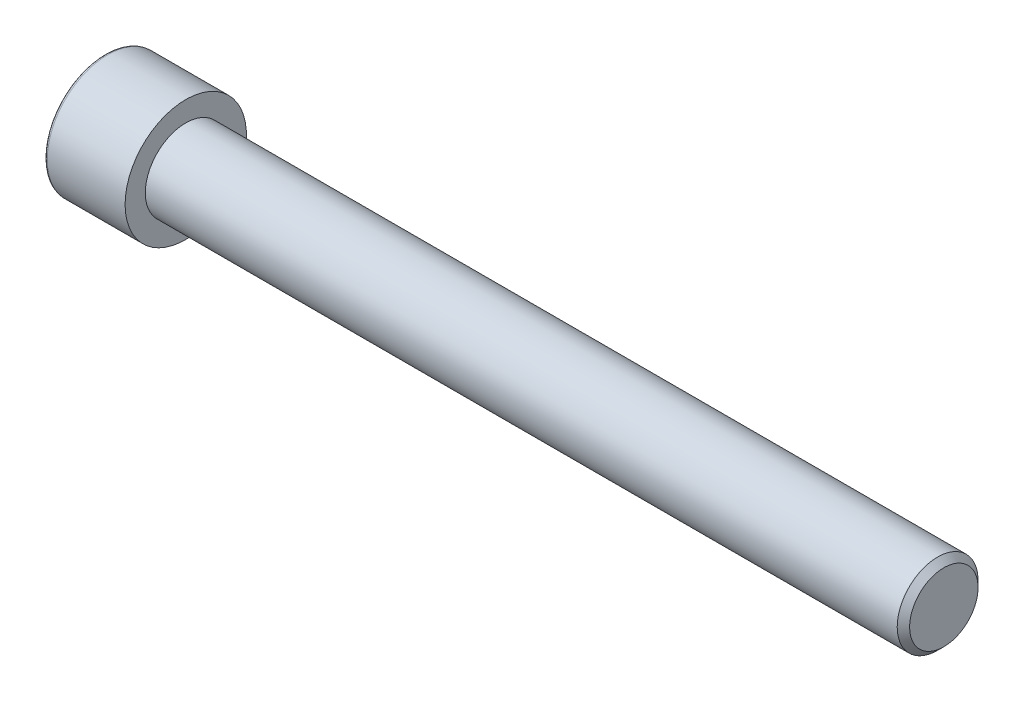
ISO-10303-21;
HEADER;
FILE_DESCRIPTION(('STEP AP214'),'2;1');
FILE_NAME('part.step','',(''),(''),'','','');
FILE_SCHEMA(('AUTOMOTIVE_DESIGN { 1 0 10303 214 1 1 1 1 }'));
ENDSEC;
DATA;
#1=APPLICATION_CONTEXT('core data for automotive mechanical design processes');
#2=APPLICATION_PROTOCOL_DEFINITION('international standard','automotive_design',2000,#1);
#3=PRODUCT_CONTEXT('',#1,'mechanical');
#4=PRODUCT('Part','Part','',(#3));
#5=PRODUCT_RELATED_PRODUCT_CATEGORY('part','',(#4));
#6=PRODUCT_DEFINITION_FORMATION('','',#4);
#7=PRODUCT_DEFINITION_CONTEXT('part definition',#1,'design');
#8=PRODUCT_DEFINITION('design','',#6,#7);
#9=PRODUCT_DEFINITION_SHAPE('','',#8);
#10=(LENGTH_UNIT() NAMED_UNIT(*) SI_UNIT(.MILLI.,.METRE.));
#11=(NAMED_UNIT(*) PLANE_ANGLE_UNIT() SI_UNIT($,.RADIAN.));
#12=(NAMED_UNIT(*) SI_UNIT($,.STERADIAN.) SOLID_ANGLE_UNIT());
#13=UNCERTAINTY_MEASURE_WITH_UNIT(LENGTH_MEASURE(1.E-05),#10,'distance_accuracy_value','');
#14=(GEOMETRIC_REPRESENTATION_CONTEXT(3) GLOBAL_UNCERTAINTY_ASSIGNED_CONTEXT((#13)) GLOBAL_UNIT_ASSIGNED_CONTEXT((#10,
#11,#12)) REPRESENTATION_CONTEXT('',''));
#15=CARTESIAN_POINT('',(0.,0.,0.));
#16=DIRECTION('',(0.,0.,1.));
#17=DIRECTION('',(1.,0.,0.));
#18=AXIS2_PLACEMENT_3D('',#15,#16,#17);
#19=CARTESIAN_POINT('',(0.,0.,0.));
#20=DIRECTION('',(1.,0.,0.));
#21=DIRECTION('',(0.,0.,-1.));
#22=AXIS2_PLACEMENT_3D('',#19,#20,#21);
#23=PLANE('',#22);
#24=DIRECTION('',(0.,-0.5,0.866025403784439));
#25=VECTOR('',#24,1.);
#26=CARTESIAN_POINT('',(0.,8.08290376865476,0.));
#27=LINE('',#26,#25);
#28=CARTESIAN_POINT('',(0.,8.08290376865476,0.));
#29=VERTEX_POINT('',#28);
#30=CARTESIAN_POINT('',(0.,4.04145188432738,7.));
#31=VERTEX_POINT('',#30);
#32=EDGE_CURVE('E99',#29,#31,#27,.T.);
#33=ORIENTED_EDGE('',*,*,#32,.T.);
#34=DIRECTION('',(0.,-1.,0.));
#35=VECTOR('',#34,1.);
#36=CARTESIAN_POINT('',(0.,4.04145188432738,7.));
#37=LINE('',#36,#35);
#38=CARTESIAN_POINT('',(0.,-4.04145188432738,7.));
#39=VERTEX_POINT('',#38);
#40=EDGE_CURVE('E106',#31,#39,#37,.T.);
#41=ORIENTED_EDGE('',*,*,#40,.T.);
#42=DIRECTION('',(0.,-0.5,-0.866025403784439));
#43=VECTOR('',#42,1.);
#44=CARTESIAN_POINT('',(0.,-4.04145188432738,7.));
#45=LINE('',#44,#43);
#46=CARTESIAN_POINT('',(0.,-8.08290376865476,0.));
#47=VERTEX_POINT('',#46);
#48=EDGE_CURVE('E112',#39,#47,#45,.T.);
#49=ORIENTED_EDGE('',*,*,#48,.T.);
#50=DIRECTION('',(0.,0.5,-0.866025403784439));
#51=VECTOR('',#50,1.);
#52=CARTESIAN_POINT('',(0.,-8.08290376865476,0.));
#53=LINE('',#52,#51);
#54=CARTESIAN_POINT('',(0.,-4.04145188432738,-7.));
#55=VERTEX_POINT('',#54);
#56=EDGE_CURVE('E121',#47,#55,#53,.T.);
#57=ORIENTED_EDGE('',*,*,#56,.T.);
#58=DIRECTION('',(0.,1.,0.));
#59=VECTOR('',#58,1.);
#60=CARTESIAN_POINT('',(0.,-4.04145188432738,-7.));
#61=LINE('',#60,#59);
#62=CARTESIAN_POINT('',(0.,4.04145188432738,-7.));
#63=VERTEX_POINT('',#62);
#64=EDGE_CURVE('E124',#55,#63,#61,.T.);
#65=ORIENTED_EDGE('',*,*,#64,.T.);
#66=DIRECTION('',(0.,0.5,0.866025403784439));
#67=VECTOR('',#66,1.);
#68=CARTESIAN_POINT('',(0.,4.04145188432738,-7.));
#69=LINE('',#68,#67);
#70=EDGE_CURVE('E117',#63,#29,#69,.T.);
#71=ORIENTED_EDGE('',*,*,#70,.T.);
#72=EDGE_LOOP('',(#33,#41,#49,#57,#65,#71));
#73=FACE_BOUND('',#72,.T.);
#74=CARTESIAN_POINT('',(0.,0.,0.));
#75=DIRECTION('',(-1.,0.,0.));
#76=DIRECTION('',(0.,0.,1.));
#77=AXIS2_PLACEMENT_3D('',#74,#75,#76);
#78=CIRCLE('',#77,11.4);
#79=CARTESIAN_POINT('',(0.,0.,11.4));
#80=VERTEX_POINT('',#79);
#81=EDGE_CURVE('E141',#80,#80,#78,.T.);
#82=ORIENTED_EDGE('',*,*,#81,.T.);
#83=EDGE_LOOP('',(#82));
#84=FACE_BOUND('',#83,.T.);
#85=ADVANCED_FACE('F38',(#73,#84),#23,.F.);
#86=CARTESIAN_POINT('',(16.,12.,0.));
#87=DIRECTION('',(-1.,0.,0.));
#88=DIRECTION('',(0.,0.,1.));
#89=AXIS2_PLACEMENT_3D('',#86,#87,#88);
#90=PLANE('',#89);
#91=CARTESIAN_POINT('',(16.,0.,0.));
#92=DIRECTION('',(-1.,0.,0.));
#93=DIRECTION('',(0.,0.,1.));
#94=AXIS2_PLACEMENT_3D('',#91,#92,#93);
#95=CIRCLE('',#94,12.);
#96=CARTESIAN_POINT('',(16.,0.,12.));
#97=VERTEX_POINT('',#96);
#98=EDGE_CURVE('E147',#97,#97,#95,.T.);
#99=ORIENTED_EDGE('',*,*,#98,.F.);
#100=EDGE_LOOP('',(#99));
#101=FACE_BOUND('',#100,.T.);
#102=CARTESIAN_POINT('',(16.,0.,0.));
#103=DIRECTION('',(-1.,0.,0.));
#104=DIRECTION('',(0.,0.,1.));
#105=AXIS2_PLACEMENT_3D('',#102,#103,#104);
#106=CIRCLE('',#105,8.);
#107=CARTESIAN_POINT('',(16.,0.,8.));
#108=VERTEX_POINT('',#107);
#109=EDGE_CURVE('E150',#108,#108,#106,.F.);
#110=ORIENTED_EDGE('',*,*,#109,.F.);
#111=EDGE_LOOP('',(#110));
#112=FACE_BOUND('',#111,.T.);
#113=ADVANCED_FACE('F209',(#101,#112),#90,.F.);
#114=CARTESIAN_POINT('',(16.,0.,0.));
#115=DIRECTION('',(-1.,0.,0.));
#116=DIRECTION('',(0.,0.,1.));
#117=AXIS2_PLACEMENT_3D('',#114,#115,#116);
#118=CYLINDRICAL_SURFACE('',#117,12.);
#119=CARTESIAN_POINT('',(0.6,0.,0.));
#120=DIRECTION('',(-1.,0.,0.));
#121=DIRECTION('',(0.,0.,1.));
#122=AXIS2_PLACEMENT_3D('',#119,#120,#121);
#123=CIRCLE('',#122,12.);
#124=CARTESIAN_POINT('',(0.6,0.,12.));
#125=VERTEX_POINT('',#124);
#126=EDGE_CURVE('E144',#125,#125,#123,.T.);
#127=ORIENTED_EDGE('',*,*,#126,.F.);
#128=EDGE_LOOP('',(#127));
#129=FACE_BOUND('',#128,.T.);
#130=ORIENTED_EDGE('',*,*,#98,.T.);
#131=EDGE_LOOP('',(#130));
#132=FACE_BOUND('',#131,.T.);
#133=ADVANCED_FACE('F213',(#129,#132),#118,.T.);
#134=CARTESIAN_POINT('',(0.600000000000005,0.,0.));
#135=DIRECTION('',(-1.,0.,0.));
#136=DIRECTION('',(0.,0.,1.));
#137=AXIS2_PLACEMENT_3D('',#134,#135,#136);
#138=TOROIDAL_SURFACE('',#137,11.4,0.600000000000009);
#139=ORIENTED_EDGE('',*,*,#126,.T.);
#140=EDGE_LOOP('',(#139));
#141=FACE_BOUND('',#140,.T.);
#142=ORIENTED_EDGE('',*,*,#81,.F.);
#143=EDGE_LOOP('',(#142));
#144=FACE_BOUND('',#143,.T.);
#145=ADVANCED_FACE('F219',(#141,#144),#138,.T.);
#146=CARTESIAN_POINT('',(166.,0.,0.));
#147=DIRECTION('',(-1.,0.,0.));
#148=DIRECTION('',(0.,0.,1.));
#149=AXIS2_PLACEMENT_3D('',#146,#147,#148);
#150=CYLINDRICAL_SURFACE('',#149,8.);
#151=ORIENTED_EDGE('',*,*,#109,.T.);
#152=EDGE_LOOP('',(#151));
#153=FACE_BOUND('',#152,.T.);
#154=CARTESIAN_POINT('',(164.773,0.,0.));
#155=DIRECTION('',(-1.,0.,0.));
#156=DIRECTION('',(0.,0.,1.));
#157=AXIS2_PLACEMENT_3D('',#154,#155,#156);
#158=CIRCLE('',#157,8.);
#159=CARTESIAN_POINT('',(164.773,0.,8.));
#160=VERTEX_POINT('',#159);
#161=EDGE_CURVE('E138',#160,#160,#158,.T.);
#162=ORIENTED_EDGE('',*,*,#161,.T.);
#163=EDGE_LOOP('',(#162));
#164=FACE_BOUND('',#163,.T.);
#165=ADVANCED_FACE('F226',(#153,#164),#150,.T.);
#166=CARTESIAN_POINT('',(166.,0.,0.));
#167=DIRECTION('',(-1.,0.,0.));
#168=DIRECTION('',(0.,0.,1.));
#169=AXIS2_PLACEMENT_3D('',#166,#167,#168);
#170=CONICAL_SURFACE('',#169,6.773,0.785398163397446);
#171=ORIENTED_EDGE('',*,*,#161,.F.);
#172=EDGE_LOOP('',(#171));
#173=FACE_BOUND('',#172,.T.);
#174=CARTESIAN_POINT('',(166.,0.,0.));
#175=DIRECTION('',(-1.,0.,0.));
#176=DIRECTION('',(0.,0.,1.));
#177=AXIS2_PLACEMENT_3D('',#174,#175,#176);
#178=CIRCLE('',#177,6.773);
#179=CARTESIAN_POINT('',(166.,0.,6.773));
#180=VERTEX_POINT('',#179);
#181=EDGE_CURVE('E102',#180,#180,#178,.T.);
#182=ORIENTED_EDGE('',*,*,#181,.T.);
#183=EDGE_LOOP('',(#182));
#184=FACE_BOUND('',#183,.T.);
#185=ADVANCED_FACE('F206',(#173,#184),#170,.T.);
#186=CARTESIAN_POINT('',(166.,6.773,0.));
#187=DIRECTION('',(-1.,0.,0.));
#188=DIRECTION('',(0.,0.,1.));
#189=AXIS2_PLACEMENT_3D('',#186,#187,#188);
#190=PLANE('',#189);
#191=ORIENTED_EDGE('',*,*,#181,.F.);
#192=EDGE_LOOP('',(#191));
#193=FACE_BOUND('',#192,.T.);
#194=ADVANCED_FACE('F202',(#193),#190,.F.);
#195=CARTESIAN_POINT('',(12.,8.08290376865476,0.));
#196=DIRECTION('',(0.,-0.866025403784439,-0.5));
#197=DIRECTION('',(0.,0.5,-0.866025403784439));
#198=AXIS2_PLACEMENT_3D('',#195,#196,#197);
#199=PLANE('',#198);
#200=DIRECTION('',(-1.,0.,0.));
#201=VECTOR('',#200,1.);
#202=CARTESIAN_POINT('',(12.,8.08290376865476,0.));
#203=LINE('',#202,#201);
#204=CARTESIAN_POINT('',(8.24081062144515,8.08290376865476,0.));
#205=VERTEX_POINT('',#204);
#206=EDGE_CURVE('E127',#205,#29,#203,.T.);
#207=ORIENTED_EDGE('',*,*,#206,.F.);
#208=CARTESIAN_POINT('',(8.24074395334994,8.0830192387086,-0.000200000000000299));
#209=CARTESIAN_POINT('',(8.29202555673095,7.99418356332252,0.153667903293391));
#210=CARTESIAN_POINT('',(8.34097980978085,7.90501666556988,0.30810950055425));
#211=CARTESIAN_POINT('',(8.4335926165143,7.72595873929905,0.618246926353254));
#212=CARTESIAN_POINT('',(8.47724888570507,7.63606741609896,0.773943265295415));
#213=CARTESIAN_POINT('',(8.59941381160494,7.36495417725225,1.24352516958246));
#214=CARTESIAN_POINT('',(8.66889984688949,7.18266208641081,1.5592643327378));
#215=CARTESIAN_POINT('',(8.75038044738534,6.9098652897096,2.03176224476633));
#216=CARTESIAN_POINT('',(8.77359191890296,6.82017566928259,2.18710922425749));
#217=CARTESIAN_POINT('',(8.81251418935198,6.64039116946081,2.49850511236216));
#218=CARTESIAN_POINT('',(8.82822565100491,6.55029632658303,2.65455395772641));
#219=CARTESIAN_POINT('',(8.85174749050138,6.36995016641051,2.96692267009517));
#220=CARTESIAN_POINT('',(8.85956683512157,6.27969914366237,3.12324202693001));
#221=CARTESIAN_POINT('',(8.86714516201213,6.09911871281642,3.43601650800788));
#222=CARTESIAN_POINT('',(8.86690439329045,6.00878930722637,3.59247162790734));
#223=CARTESIAN_POINT('',(8.85516567196884,5.76131663355911,4.02110687218394));
#224=CARTESIAN_POINT('',(8.83545966104152,5.60425437562033,4.2931466828854));
#225=CARTESIAN_POINT('',(8.77297194365867,5.29117305327856,4.8354194400822));
#226=CARTESIAN_POINT('',(8.73016887967145,5.13515508991674,5.10565047951828));
#227=CARTESIAN_POINT('',(8.62317372407408,4.82144370220969,5.64901454193984));
#228=CARTESIAN_POINT('',(8.55852830921477,4.66378986193159,5.92207900330984));
#229=CARTESIAN_POINT('',(8.4118093319374,4.35083323311213,6.46413578499063));
#230=CARTESIAN_POINT('',(8.32977023275887,4.19552643669177,6.73313504715144));
#231=CARTESIAN_POINT('',(8.24074395334994,4.04133641427354,7.0002));
#232=B_SPLINE_CURVE_WITH_KNOTS('',3,(#208,#209,#210,#211,#212,#213,#214,#215,#216,#217,#218,
#219,#220,#221,#222,#223,#224,#225,#226,#227,#228,#229,#230,#231),.UNSPECIFIED.,.F.,.F.,(4,2,2,
2,2,2,2,2,2,2,2,4),(0.,0.554727910214695,1.10969417576209,2.2219327402719,2.76443041023617,
3.30688013473357,3.8487128486711,4.39052882332379,5.33376515141419,6.27787517570456,
7.2429241888324,8.20607866430097),.UNSPECIFIED.);
#233=CARTESIAN_POINT('',(8.24081062144515,4.04145188432738,7.));
#234=VERTEX_POINT('',#233);
#235=EDGE_CURVE('E11',#205,#234,#232,.T.);
#236=ORIENTED_EDGE('',*,*,#235,.T.);
#237=DIRECTION('',(-1.,0.,0.));
#238=VECTOR('',#237,1.);
#239=CARTESIAN_POINT('',(12.,4.04145188432738,7.));
#240=LINE('',#239,#238);
#241=EDGE_CURVE('E94',#234,#31,#240,.T.);
#242=ORIENTED_EDGE('',*,*,#241,.T.);
#243=ORIENTED_EDGE('',*,*,#32,.F.);
#244=EDGE_LOOP('',(#207,#236,#242,#243));
#245=FACE_BOUND('',#244,.T.);
#246=ADVANCED_FACE('F97',(#245),#199,.T.);
#247=CARTESIAN_POINT('',(12.,4.04145188432738,7.));
#248=DIRECTION('',(0.,0.,-1.));
#249=DIRECTION('',(-1.,0.,0.));
#250=AXIS2_PLACEMENT_3D('',#247,#248,#249);
#251=PLANE('',#250);
#252=ORIENTED_EDGE('',*,*,#241,.F.);
#253=CARTESIAN_POINT('',(5.57587941292219,-10.5951395559688,7.));
#254=CARTESIAN_POINT('',(5.72215788472476,-10.2913873854027,7.));
#255=CARTESIAN_POINT('',(5.86695568880045,-9.98690898111586,7.));
#256=CARTESIAN_POINT('',(6.15275105757623,-9.37611217415566,7.));
#257=CARTESIAN_POINT('',(6.29374796487649,-9.06979346424692,7.));
#258=CARTESIAN_POINT('',(6.57186848515588,-8.45322208251383,7.));
#259=CARTESIAN_POINT('',(6.70896439043919,-8.14295686634533,7.));
#260=CARTESIAN_POINT('',(6.97718199770579,-7.51986421385499,7.));
#261=CARTESIAN_POINT('',(7.10830400201994,-7.20703690814435,7.));
#262=CARTESIAN_POINT('',(7.36656028504088,-6.5695005443991,7.));
#263=CARTESIAN_POINT('',(7.49348005127018,-6.24470408202464,7.));
#264=CARTESIAN_POINT('',(7.73706702336103,-5.59121778689269,7.));
#265=CARTESIAN_POINT('',(7.85373304467385,-5.26252750927219,7.));
#266=CARTESIAN_POINT('',(8.07355811047227,-4.60143032919695,7.));
#267=CARTESIAN_POINT('',(8.17674688296708,-4.2690334243111,7.));
#268=CARTESIAN_POINT('',(8.36613945739777,-3.59949554460914,7.));
#269=CARTESIAN_POINT('',(8.45234888881718,-3.2623561820045,7.));
#270=CARTESIAN_POINT('',(8.60305564581958,-2.58479315996282,7.));
#271=CARTESIAN_POINT('',(8.66765350449936,-2.24439250484352,7.));
#272=CARTESIAN_POINT('',(8.74539831642546,-1.73091216973467,7.));
#273=CARTESIAN_POINT('',(8.7681223476882,-1.55925781299778,7.));
#274=CARTESIAN_POINT('',(8.80673620890492,-1.21518758086266,7.));
#275=CARTESIAN_POINT('',(8.82262668929935,-1.04277177952026,7.));
#276=CARTESIAN_POINT('',(8.84707027467927,-0.699545376197852,7.));
#277=CARTESIAN_POINT('',(8.85571101390069,-0.528741034985779,7.));
#278=CARTESIAN_POINT('',(8.86578587656476,-0.1869208499621,7.));
#279=CARTESIAN_POINT('',(8.86722011156257,-0.0159050094654492,7.));
#280=CARTESIAN_POINT('',(8.86284767868586,0.326038893609979,7.));
#281=CARTESIAN_POINT('',(8.85704082162707,0.496966953778641,7.));
#282=CARTESIAN_POINT('',(8.8383221933219,0.838436119348584,7.));
#283=CARTESIAN_POINT('',(8.82541002346138,1.00897720250108,7.));
#284=CARTESIAN_POINT('',(8.78532318764043,1.42691016284093,7.));
#285=CARTESIAN_POINT('',(8.75433158385114,1.67394276264429,7.));
#286=CARTESIAN_POINT('',(8.67919370737725,2.1659883041221,7.));
#287=CARTESIAN_POINT('',(8.63504542432949,2.41100093125723,7.));
#288=CARTESIAN_POINT('',(8.48522311454851,3.14282333035987,7.));
#289=CARTESIAN_POINT('',(8.36220388516809,3.62611875071593,7.));
#290=CARTESIAN_POINT('',(8.15116787960062,4.3487805325071,7.));
#291=CARTESIAN_POINT('',(8.07542139419739,4.59194251167669,7.));
#292=CARTESIAN_POINT('',(7.9166482621531,5.07590132488677,7.));
#293=CARTESIAN_POINT('',(7.83362156396132,5.31669814216627,7.));
#294=CARTESIAN_POINT('',(7.66157133885048,5.79601723780591,7.));
#295=CARTESIAN_POINT('',(7.5725500954382,6.03454034320772,7.));
#296=CARTESIAN_POINT('',(7.3894995127239,6.50964710521445,7.));
#297=CARTESIAN_POINT('',(7.29547025517154,6.74623079340525,7.));
#298=CARTESIAN_POINT('',(7.05091022334063,7.34607004782587,7.));
#299=CARTESIAN_POINT('',(6.89749500530549,7.70814802994476,7.));
#300=CARTESIAN_POINT('',(6.58311405374231,8.42902142446664,7.));
#301=CARTESIAN_POINT('',(6.4221477486436,8.78781658591592,7.));
#302=CARTESIAN_POINT('',(6.09434206590049,9.5028229612945,7.));
#303=CARTESIAN_POINT('',(5.92750112189063,9.85903345506375,7.));
#304=CARTESIAN_POINT('',(5.58925640841321,10.5692634953458,7.));
#305=CARTESIAN_POINT('',(5.41785276367774,10.9232831014262,7.));
#306=CARTESIAN_POINT('',(5.07120500870259,11.6299725078319,7.));
#307=CARTESIAN_POINT('',(4.8959564472764,11.982640120912,7.));
#308=CARTESIAN_POINT('',(4.54252537077448,12.6865021421779,7.));
#309=CARTESIAN_POINT('',(4.3643428393958,13.0376965421641,7.));
#310=CARTESIAN_POINT('',(3.82629497051468,14.0893490285881,7.));
#311=CARTESIAN_POINT('',(3.46287434288011,14.7879876175435,7.));
#312=CARTESIAN_POINT('',(2.76400520764348,16.1163630798682,7.));
#313=CARTESIAN_POINT('',(2.42913665633273,16.7464064050781,7.));
#314=CARTESIAN_POINT('',(1.75544455886196,18.0044087683408,7.));
#315=CARTESIAN_POINT('',(1.4166208425721,18.6323677152318,7.));
#316=CARTESIAN_POINT('',(0.736900591610472,19.8850342571872,7.));
#317=CARTESIAN_POINT('',(0.396011800685717,20.5097460603558,7.));
#318=CARTESIAN_POINT('',(-0.288064689435112,21.7578620874728,7.));
#319=CARTESIAN_POINT('',(-0.631252251240716,22.3812663866935,7.));
#320=CARTESIAN_POINT('',(-0.975285006989568,23.0042010690845,7.));
#321=B_SPLINE_CURVE_WITH_KNOTS('',3,(#253,#254,#255,#256,#257,#258,#259,#260,#261,#262,#263,
#264,#265,#266,#267,#268,#269,#270,#271,#272,#273,#274,#275,#276,#277,#278,#279,#280,#281,#282,
#283,#284,#285,#286,#287,#288,#289,#290,#291,#292,#293,#294,#295,#296,#297,#298,#299,#300,#301,
#302,#303,#304,#305,#306,#307,#308,#309,#310,#311,#312,#313,#314,#315,#316,#317,#318,#319,#320),
.UNSPECIFIED.,.F.,.F.,(4,2,2,2,2,2,2,2,2,2,2,2,2,2,2,2,2,2,2,2,2,2,2,2,2,2,2,2,2,2,2,2,2,4),(0.,
1.01143101724814,2.02303586270392,3.04059952013218,4.0581116227373,5.10411913857804,
6.15024733449321,7.19402754905384,8.23746111460828,9.27597104351024,9.79531214242649,
10.3146037977555,10.8275239688931,11.3404362001106,11.8533618322016,12.3663162427945,
13.1127965817182,13.8593910426537,15.3534778065278,16.1174816538324,16.8814909114363,
17.6452107630153,18.4089181516302,19.5885110371782,20.7681933551521,21.9481926318707,
23.1281596836154,24.3095735159024,25.4909939150696,27.8534625107793,29.9939673638473,
32.1345646316569,34.269560689375,36.4044302636885),.UNSPECIFIED.);
#322=CARTESIAN_POINT('',(8.24081062144515,-4.04145188432738,7.));
#323=VERTEX_POINT('',#322);
#324=EDGE_CURVE('E50',#234,#323,#321,.F.);
#325=ORIENTED_EDGE('',*,*,#324,.T.);
#326=DIRECTION('',(-1.,0.,0.));
#327=VECTOR('',#326,1.);
#328=CARTESIAN_POINT('',(12.,-4.04145188432738,7.));
#329=LINE('',#328,#327);
#330=EDGE_CURVE('E103',#323,#39,#329,.T.);
#331=ORIENTED_EDGE('',*,*,#330,.T.);
#332=ORIENTED_EDGE('',*,*,#40,.F.);
#333=EDGE_LOOP('',(#252,#325,#331,#332));
#334=FACE_BOUND('',#333,.T.);
#335=ADVANCED_FACE('F107',(#334),#251,.T.);
#336=CARTESIAN_POINT('',(12.,-4.04145188432738,7.));
#337=DIRECTION('',(0.,0.866025403784439,-0.5));
#338=DIRECTION('',(0.,0.5,0.866025403784439));
#339=AXIS2_PLACEMENT_3D('',#336,#337,#338);
#340=PLANE('',#339);
#341=ORIENTED_EDGE('',*,*,#330,.F.);
#342=CARTESIAN_POINT('',(8.24074395334994,-4.04133641427354,7.0002));
#343=CARTESIAN_POINT('',(8.29202555673095,-4.13017208965963,6.84633209670661));
#344=CARTESIAN_POINT('',(8.34097980978085,-4.21933898741226,6.69189049944575));
#345=CARTESIAN_POINT('',(8.4335926165143,-4.39839691368309,6.38175307364674));
#346=CARTESIAN_POINT('',(8.47724888570507,-4.48828823688319,6.22605673470458));
#347=CARTESIAN_POINT('',(8.59941381160494,-4.75940147572989,5.75647483041753));
#348=CARTESIAN_POINT('',(8.66889984688949,-4.94169356657133,5.4407356672622));
#349=CARTESIAN_POINT('',(8.75038044738534,-5.21449036327254,4.96823775523367));
#350=CARTESIAN_POINT('',(8.77359191890296,-5.30417998369956,4.81289077574251));
#351=CARTESIAN_POINT('',(8.81251418935198,-5.48396448352133,4.50149488763783));
#352=CARTESIAN_POINT('',(8.82822565100491,-5.57405932639911,4.34544604227359));
#353=CARTESIAN_POINT('',(8.85174749050138,-5.75440548657163,4.03307732990482));
#354=CARTESIAN_POINT('',(8.85956683512157,-5.84465650931978,3.87675797306999));
#355=CARTESIAN_POINT('',(8.86714516201213,-6.02523694016573,3.56398349199212));
#356=CARTESIAN_POINT('',(8.86690439329045,-6.11556634575578,3.40752837209266));
#357=CARTESIAN_POINT('',(8.85516567196884,-6.36303901942303,2.97889312781606));
#358=CARTESIAN_POINT('',(8.83545966104152,-6.52010127736182,2.7068533171146));
#359=CARTESIAN_POINT('',(8.77297194365867,-6.83318259970359,2.1645805599178));
#360=CARTESIAN_POINT('',(8.73016887967145,-6.9892005630654,1.89434952048172));
#361=CARTESIAN_POINT('',(8.62317372407408,-7.30291195077246,1.35098545806016));
#362=CARTESIAN_POINT('',(8.55852830921477,-7.46056579105055,1.07792099669016));
#363=CARTESIAN_POINT('',(8.4118093319374,-7.77352241987001,0.53586421500937));
#364=CARTESIAN_POINT('',(8.32977023275887,-7.92882921629037,0.266864952848559));
#365=CARTESIAN_POINT('',(8.24074395334994,-8.0830192387086,-0.000200000000000452));
#366=B_SPLINE_CURVE_WITH_KNOTS('',3,(#342,#343,#344,#345,#346,#347,#348,#349,#350,#351,#352,
#353,#354,#355,#356,#357,#358,#359,#360,#361,#362,#363,#364,#365),.UNSPECIFIED.,.F.,.F.,(4,2,2,
2,2,2,2,2,2,2,2,4),(0.,0.554727910214695,1.10969417576209,2.2219327402719,2.76443041023617,
3.30688013473358,3.8487128486711,4.39052882332379,5.33376515141419,6.27787517570456,
7.2429241888324,8.20607866430097),.UNSPECIFIED.);
#367=CARTESIAN_POINT('',(8.24081062144515,-8.08290376865476,0.));
#368=VERTEX_POINT('',#367);
#369=EDGE_CURVE('E60',#323,#368,#366,.T.);
#370=ORIENTED_EDGE('',*,*,#369,.T.);
#371=DIRECTION('',(-1.,0.,0.));
#372=VECTOR('',#371,1.);
#373=CARTESIAN_POINT('',(12.,-8.08290376865476,0.));
#374=LINE('',#373,#372);
#375=EDGE_CURVE('E133',#368,#47,#374,.T.);
#376=ORIENTED_EDGE('',*,*,#375,.T.);
#377=ORIENTED_EDGE('',*,*,#48,.F.);
#378=EDGE_LOOP('',(#341,#370,#376,#377));
#379=FACE_BOUND('',#378,.T.);
#380=ADVANCED_FACE('F182',(#379),#340,.T.);
#381=CARTESIAN_POINT('',(12.,-8.08290376865476,0.));
#382=DIRECTION('',(0.,0.866025403784439,0.5));
#383=DIRECTION('',(0.,-0.5,0.866025403784439));
#384=AXIS2_PLACEMENT_3D('',#381,#382,#383);
#385=PLANE('',#384);
#386=ORIENTED_EDGE('',*,*,#375,.F.);
#387=CARTESIAN_POINT('',(8.24074395334994,-8.0830192387086,0.000200000000000299));
#388=CARTESIAN_POINT('',(8.29202555673095,-7.99418356332252,-0.153667903293391));
#389=CARTESIAN_POINT('',(8.34097980978085,-7.90501666556988,-0.30810950055425));
#390=CARTESIAN_POINT('',(8.4335926165143,-7.72595873929905,-0.618246926353254));
#391=CARTESIAN_POINT('',(8.47724888570507,-7.63606741609896,-0.773943265295415));
#392=CARTESIAN_POINT('',(8.59941381160494,-7.36495417725225,-1.24352516958246));
#393=CARTESIAN_POINT('',(8.66889984688949,-7.18266208641081,-1.5592643327378));
#394=CARTESIAN_POINT('',(8.75038044738534,-6.9098652897096,-2.03176224476633));
#395=CARTESIAN_POINT('',(8.77359191890296,-6.82017566928259,-2.18710922425749));
#396=CARTESIAN_POINT('',(8.81251418935198,-6.64039116946081,-2.49850511236216));
#397=CARTESIAN_POINT('',(8.82822565100491,-6.55029632658303,-2.65455395772641));
#398=CARTESIAN_POINT('',(8.85174749050138,-6.36995016641051,-2.96692267009517));
#399=CARTESIAN_POINT('',(8.85956683512157,-6.27969914366237,-3.12324202693001));
#400=CARTESIAN_POINT('',(8.86714516201213,-6.09911871281642,-3.43601650800788));
#401=CARTESIAN_POINT('',(8.86690439329045,-6.00878930722637,-3.59247162790734));
#402=CARTESIAN_POINT('',(8.85516567196884,-5.76131663355911,-4.02110687218394));
#403=CARTESIAN_POINT('',(8.83545966104152,-5.60425437562033,-4.2931466828854));
#404=CARTESIAN_POINT('',(8.77297194365867,-5.29117305327856,-4.8354194400822));
#405=CARTESIAN_POINT('',(8.73016887967145,-5.13515508991674,-5.10565047951828));
#406=CARTESIAN_POINT('',(8.62317372407408,-4.82144370220969,-5.64901454193984));
#407=CARTESIAN_POINT('',(8.55852830921477,-4.66378986193159,-5.92207900330984));
#408=CARTESIAN_POINT('',(8.4118093319374,-4.35083323311213,-6.46413578499063));
#409=CARTESIAN_POINT('',(8.32977023275887,-4.19552643669177,-6.73313504715144));
#410=CARTESIAN_POINT('',(8.24074395334994,-4.04133641427354,-7.0002));
#411=B_SPLINE_CURVE_WITH_KNOTS('',3,(#387,#388,#389,#390,#391,#392,#393,#394,#395,#396,#397,
#398,#399,#400,#401,#402,#403,#404,#405,#406,#407,#408,#409,#410),.UNSPECIFIED.,.F.,.F.,(4,2,2,
2,2,2,2,2,2,2,2,4),(0.,0.554727910214695,1.10969417576209,2.2219327402719,2.76443041023617,
3.30688013473357,3.8487128486711,4.39052882332379,5.33376515141419,6.27787517570456,
7.2429241888324,8.20607866430097),.UNSPECIFIED.);
#412=CARTESIAN_POINT('',(8.24081062144515,-4.04145188432738,-7.));
#413=VERTEX_POINT('',#412);
#414=EDGE_CURVE('E186',#368,#413,#411,.T.);
#415=ORIENTED_EDGE('',*,*,#414,.T.);
#416=DIRECTION('',(-1.,0.,0.));
#417=VECTOR('',#416,1.);
#418=CARTESIAN_POINT('',(12.,-4.04145188432738,-7.));
#419=LINE('',#418,#417);
#420=EDGE_CURVE('E131',#413,#55,#419,.T.);
#421=ORIENTED_EDGE('',*,*,#420,.T.);
#422=ORIENTED_EDGE('',*,*,#56,.F.);
#423=EDGE_LOOP('',(#386,#415,#421,#422));
#424=FACE_BOUND('',#423,.T.);
#425=ADVANCED_FACE('F177',(#424),#385,.T.);
#426=CARTESIAN_POINT('',(12.,-4.04145188432738,-7.));
#427=DIRECTION('',(0.,0.,1.));
#428=DIRECTION('',(1.,0.,0.));
#429=AXIS2_PLACEMENT_3D('',#426,#427,#428);
#430=PLANE('',#429);
#431=ORIENTED_EDGE('',*,*,#420,.F.);
#432=CARTESIAN_POINT('',(5.57587941292219,-10.5951395559688,-7.));
#433=CARTESIAN_POINT('',(5.72215788472476,-10.2913873854027,-7.));
#434=CARTESIAN_POINT('',(5.86695568880045,-9.98690898111586,-7.));
#435=CARTESIAN_POINT('',(6.15275105757623,-9.37611217415566,-7.));
#436=CARTESIAN_POINT('',(6.29374796487649,-9.06979346424692,-7.));
#437=CARTESIAN_POINT('',(6.57186848515588,-8.45322208251383,-7.));
#438=CARTESIAN_POINT('',(6.70896439043919,-8.14295686634533,-7.));
#439=CARTESIAN_POINT('',(6.97718199770579,-7.51986421385499,-7.));
#440=CARTESIAN_POINT('',(7.10830400201994,-7.20703690814435,-7.));
#441=CARTESIAN_POINT('',(7.36656028504088,-6.5695005443991,-7.));
#442=CARTESIAN_POINT('',(7.49348005127018,-6.24470408202464,-7.));
#443=CARTESIAN_POINT('',(7.73706702336103,-5.59121778689269,-7.));
#444=CARTESIAN_POINT('',(7.85373304467385,-5.26252750927219,-7.));
#445=CARTESIAN_POINT('',(8.07355811047227,-4.60143032919695,-7.));
#446=CARTESIAN_POINT('',(8.17674688296708,-4.2690334243111,-7.));
#447=CARTESIAN_POINT('',(8.36613945739777,-3.59949554460914,-7.));
#448=CARTESIAN_POINT('',(8.45234888881718,-3.2623561820045,-7.));
#449=CARTESIAN_POINT('',(8.60305564581958,-2.58479315996282,-7.));
#450=CARTESIAN_POINT('',(8.66765350449936,-2.24439250484352,-7.));
#451=CARTESIAN_POINT('',(8.74539831642546,-1.73091216973467,-7.));
#452=CARTESIAN_POINT('',(8.7681223476882,-1.55925781299778,-7.));
#453=CARTESIAN_POINT('',(8.80673620890492,-1.21518758086266,-7.));
#454=CARTESIAN_POINT('',(8.82262668929935,-1.04277177952026,-7.));
#455=CARTESIAN_POINT('',(8.84707027467927,-0.699545376197852,-7.));
#456=CARTESIAN_POINT('',(8.85571101390069,-0.528741034985779,-7.));
#457=CARTESIAN_POINT('',(8.86578587656476,-0.1869208499621,-7.));
#458=CARTESIAN_POINT('',(8.86722011156257,-0.0159050094654492,-7.));
#459=CARTESIAN_POINT('',(8.86284767868586,0.326038893609979,-7.));
#460=CARTESIAN_POINT('',(8.85704082162707,0.496966953778641,-7.));
#461=CARTESIAN_POINT('',(8.8383221933219,0.838436119348584,-7.));
#462=CARTESIAN_POINT('',(8.82541002346138,1.00897720250108,-7.));
#463=CARTESIAN_POINT('',(8.78532318764043,1.42691016284093,-7.));
#464=CARTESIAN_POINT('',(8.75433158385114,1.67394276264429,-7.));
#465=CARTESIAN_POINT('',(8.67919370737725,2.1659883041221,-7.));
#466=CARTESIAN_POINT('',(8.63504542432949,2.41100093125723,-7.));
#467=CARTESIAN_POINT('',(8.48522311454851,3.14282333035987,-7.));
#468=CARTESIAN_POINT('',(8.36220388516809,3.62611875071593,-7.));
#469=CARTESIAN_POINT('',(8.15116787960062,4.3487805325071,-7.));
#470=CARTESIAN_POINT('',(8.07542139419739,4.59194251167669,-7.));
#471=CARTESIAN_POINT('',(7.9166482621531,5.07590132488677,-7.));
#472=CARTESIAN_POINT('',(7.83362156396132,5.31669814216627,-7.));
#473=CARTESIAN_POINT('',(7.66157133885048,5.79601723780591,-7.));
#474=CARTESIAN_POINT('',(7.5725500954382,6.03454034320772,-7.));
#475=CARTESIAN_POINT('',(7.3894995127239,6.50964710521445,-7.));
#476=CARTESIAN_POINT('',(7.29547025517154,6.74623079340525,-7.));
#477=CARTESIAN_POINT('',(7.05091022334063,7.34607004782587,-7.));
#478=CARTESIAN_POINT('',(6.89749500530549,7.70814802994476,-7.));
#479=CARTESIAN_POINT('',(6.58311405374231,8.42902142446664,-7.));
#480=CARTESIAN_POINT('',(6.4221477486436,8.78781658591592,-7.));
#481=CARTESIAN_POINT('',(6.09434206590049,9.5028229612945,-7.));
#482=CARTESIAN_POINT('',(5.92750112189063,9.85903345506375,-7.));
#483=CARTESIAN_POINT('',(5.58925640841321,10.5692634953458,-7.));
#484=CARTESIAN_POINT('',(5.41785276367774,10.9232831014262,-7.));
#485=CARTESIAN_POINT('',(5.07120500870259,11.6299725078319,-7.));
#486=CARTESIAN_POINT('',(4.8959564472764,11.982640120912,-7.));
#487=CARTESIAN_POINT('',(4.54252537077448,12.6865021421779,-7.));
#488=CARTESIAN_POINT('',(4.3643428393958,13.0376965421641,-7.));
#489=CARTESIAN_POINT('',(3.82629497051468,14.0893490285881,-7.));
#490=CARTESIAN_POINT('',(3.46287434288011,14.7879876175435,-7.));
#491=CARTESIAN_POINT('',(2.76400520764348,16.1163630798682,-7.));
#492=CARTESIAN_POINT('',(2.42913665633273,16.7464064050781,-7.));
#493=CARTESIAN_POINT('',(1.75544455886196,18.0044087683408,-7.));
#494=CARTESIAN_POINT('',(1.4166208425721,18.6323677152318,-7.));
#495=CARTESIAN_POINT('',(0.736900591610472,19.8850342571872,-7.));
#496=CARTESIAN_POINT('',(0.396011800685717,20.5097460603558,-7.));
#497=CARTESIAN_POINT('',(-0.288064689435112,21.7578620874728,-7.));
#498=CARTESIAN_POINT('',(-0.631252251240716,22.3812663866935,-7.));
#499=CARTESIAN_POINT('',(-0.975285006989568,23.0042010690845,-7.));
#500=B_SPLINE_CURVE_WITH_KNOTS('',3,(#432,#433,#434,#435,#436,#437,#438,#439,#440,#441,#442,
#443,#444,#445,#446,#447,#448,#449,#450,#451,#452,#453,#454,#455,#456,#457,#458,#459,#460,#461,
#462,#463,#464,#465,#466,#467,#468,#469,#470,#471,#472,#473,#474,#475,#476,#477,#478,#479,#480,
#481,#482,#483,#484,#485,#486,#487,#488,#489,#490,#491,#492,#493,#494,#495,#496,#497,#498,#499),
.UNSPECIFIED.,.F.,.F.,(4,2,2,2,2,2,2,2,2,2,2,2,2,2,2,2,2,2,2,2,2,2,2,2,2,2,2,2,2,2,2,2,2,4),(0.,
1.01143101724814,2.02303586270392,3.04059952013218,4.0581116227373,5.10411913857804,
6.15024733449321,7.19402754905384,8.23746111460828,9.27597104351024,9.79531214242649,
10.3146037977555,10.8275239688931,11.3404362001106,11.8533618322016,12.3663162427945,
13.1127965817182,13.8593910426537,15.3534778065278,16.1174816538324,16.8814909114363,
17.6452107630153,18.4089181516302,19.5885110371782,20.7681933551521,21.9481926318707,
23.1281596836154,24.3095735159024,25.4909939150696,27.8534625107793,29.9939673638473,
32.1345646316569,34.269560689375,36.4044302636885),.UNSPECIFIED.);
#501=CARTESIAN_POINT('',(8.24081062144515,4.04145188432738,-7.));
#502=VERTEX_POINT('',#501);
#503=EDGE_CURVE('E160',#413,#502,#500,.T.);
#504=ORIENTED_EDGE('',*,*,#503,.T.);
#505=DIRECTION('',(-1.,0.,0.));
#506=VECTOR('',#505,1.);
#507=CARTESIAN_POINT('',(12.,4.04145188432738,-7.));
#508=LINE('',#507,#506);
#509=EDGE_CURVE('E129',#502,#63,#508,.T.);
#510=ORIENTED_EDGE('',*,*,#509,.T.);
#511=ORIENTED_EDGE('',*,*,#64,.F.);
#512=EDGE_LOOP('',(#431,#504,#510,#511));
#513=FACE_BOUND('',#512,.T.);
#514=ADVANCED_FACE('F172',(#513),#430,.T.);
#515=CARTESIAN_POINT('',(12.,4.04145188432738,-7.));
#516=DIRECTION('',(0.,-0.866025403784439,0.5));
#517=DIRECTION('',(0.,-0.5,-0.866025403784439));
#518=AXIS2_PLACEMENT_3D('',#515,#516,#517);
#519=PLANE('',#518);
#520=ORIENTED_EDGE('',*,*,#509,.F.);
#521=CARTESIAN_POINT('',(8.24074395334994,4.04133641427354,-7.0002));
#522=CARTESIAN_POINT('',(8.29202555673095,4.13017208965963,-6.84633209670661));
#523=CARTESIAN_POINT('',(8.34097980978085,4.21933898741226,-6.69189049944575));
#524=CARTESIAN_POINT('',(8.4335926165143,4.39839691368309,-6.38175307364674));
#525=CARTESIAN_POINT('',(8.47724888570507,4.48828823688319,-6.22605673470458));
#526=CARTESIAN_POINT('',(8.59941381160494,4.75940147572989,-5.75647483041753));
#527=CARTESIAN_POINT('',(8.66889984688949,4.94169356657133,-5.4407356672622));
#528=CARTESIAN_POINT('',(8.75038044738534,5.21449036327254,-4.96823775523367));
#529=CARTESIAN_POINT('',(8.77359191890296,5.30417998369956,-4.81289077574251));
#530=CARTESIAN_POINT('',(8.81251418935198,5.48396448352133,-4.50149488763783));
#531=CARTESIAN_POINT('',(8.82822565100491,5.57405932639911,-4.34544604227359));
#532=CARTESIAN_POINT('',(8.85174749050138,5.75440548657163,-4.03307732990482));
#533=CARTESIAN_POINT('',(8.85956683512157,5.84465650931978,-3.87675797306999));
#534=CARTESIAN_POINT('',(8.86714516201213,6.02523694016573,-3.56398349199212));
#535=CARTESIAN_POINT('',(8.86690439329045,6.11556634575578,-3.40752837209266));
#536=CARTESIAN_POINT('',(8.85516567196884,6.36303901942303,-2.97889312781606));
#537=CARTESIAN_POINT('',(8.83545966104152,6.52010127736182,-2.7068533171146));
#538=CARTESIAN_POINT('',(8.77297194365867,6.83318259970359,-2.1645805599178));
#539=CARTESIAN_POINT('',(8.73016887967145,6.9892005630654,-1.89434952048172));
#540=CARTESIAN_POINT('',(8.62317372407408,7.30291195077246,-1.35098545806016));
#541=CARTESIAN_POINT('',(8.55852830921477,7.46056579105055,-1.07792099669016));
#542=CARTESIAN_POINT('',(8.4118093319374,7.77352241987001,-0.53586421500937));
#543=CARTESIAN_POINT('',(8.32977023275887,7.92882921629037,-0.266864952848559));
#544=CARTESIAN_POINT('',(8.24074395334994,8.0830192387086,0.000200000000000452));
#545=B_SPLINE_CURVE_WITH_KNOTS('',3,(#521,#522,#523,#524,#525,#526,#527,#528,#529,#530,#531,
#532,#533,#534,#535,#536,#537,#538,#539,#540,#541,#542,#543,#544),.UNSPECIFIED.,.F.,.F.,(4,2,2,
2,2,2,2,2,2,2,2,4),(0.,0.554727910214695,1.10969417576209,2.2219327402719,2.76443041023617,
3.30688013473358,3.8487128486711,4.39052882332379,5.33376515141419,6.27787517570456,
7.2429241888324,8.20607866430097),.UNSPECIFIED.);
#546=EDGE_CURVE('E153',#502,#205,#545,.T.);
#547=ORIENTED_EDGE('',*,*,#546,.T.);
#548=ORIENTED_EDGE('',*,*,#206,.T.);
#549=ORIENTED_EDGE('',*,*,#70,.F.);
#550=EDGE_LOOP('',(#520,#547,#548,#549));
#551=FACE_BOUND('',#550,.T.);
#552=ADVANCED_FACE('F169',(#551),#519,.T.);
#553=CARTESIAN_POINT('',(12.9074772881118,0.,0.));
#554=DIRECTION('',(-1.,0.,0.));
#555=DIRECTION('',(0.,0.,1.));
#556=AXIS2_PLACEMENT_3D('',#553,#554,#555);
#557=CONICAL_SURFACE('',#556,0.,1.0471975511966);
#558=ORIENTED_EDGE('',*,*,#235,.F.);
#559=ORIENTED_EDGE('',*,*,#546,.F.);
#560=ORIENTED_EDGE('',*,*,#503,.F.);
#561=ORIENTED_EDGE('',*,*,#414,.F.);
#562=ORIENTED_EDGE('',*,*,#369,.F.);
#563=ORIENTED_EDGE('',*,*,#324,.F.);
#564=EDGE_LOOP('',(#558,#559,#560,#561,#562,#563));
#565=FACE_BOUND('',#564,.T.);
#566=CARTESIAN_POINT('',(12.9074772881118,0.,0.));
#567=VERTEX_POINT('',#566);
#568=VERTEX_LOOP('',#567);
#569=FACE_BOUND('',#568,.T.);
#570=ADVANCED_FACE('F166',(#565,#569),#557,.F.);
#571=CLOSED_SHELL('',(#85,#113,#133,#145,#165,#185,#194,#246,#335,#380,#425,#514,#552,#570));
#572=MANIFOLD_SOLID_BREP('B2',#571);
#573=ADVANCED_BREP_SHAPE_REPRESENTATION('',(#18,#572),#14);
#574=SHAPE_DEFINITION_REPRESENTATION(#9,#573);
ENDSEC;
END-ISO-10303-21;
